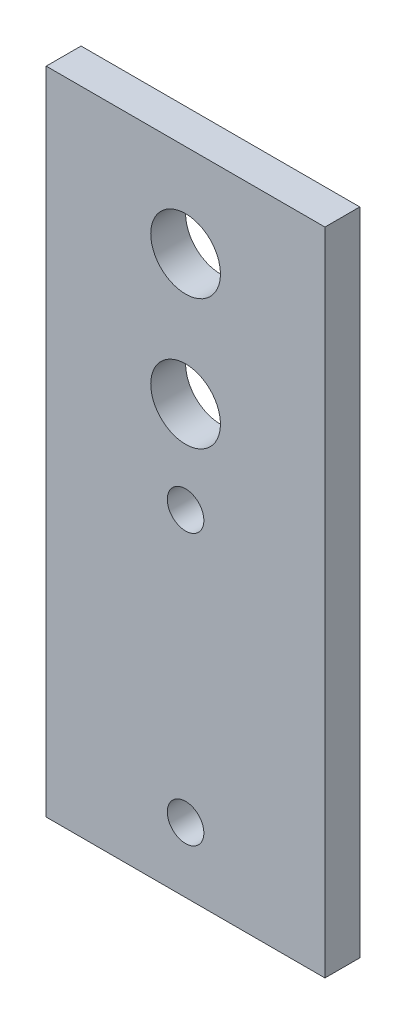
ISO-10303-21;
HEADER;
FILE_DESCRIPTION(('STEP AP214'),'2;1');
FILE_NAME('part.step','',(''),(''),'','','');
FILE_SCHEMA(('AUTOMOTIVE_DESIGN { 1 0 10303 214 1 1 1 1 }'));
ENDSEC;
DATA;
#1=APPLICATION_CONTEXT('core data for automotive mechanical design processes');
#2=APPLICATION_PROTOCOL_DEFINITION('international standard','automotive_design',2000,#1);
#3=PRODUCT_CONTEXT('',#1,'mechanical');
#4=PRODUCT('Part','Part','',(#3));
#5=PRODUCT_RELATED_PRODUCT_CATEGORY('part','',(#4));
#6=PRODUCT_DEFINITION_FORMATION('','',#4);
#7=PRODUCT_DEFINITION_CONTEXT('part definition',#1,'design');
#8=PRODUCT_DEFINITION('design','',#6,#7);
#9=PRODUCT_DEFINITION_SHAPE('','',#8);
#10=(LENGTH_UNIT() NAMED_UNIT(*) SI_UNIT(.MILLI.,.METRE.));
#11=(NAMED_UNIT(*) PLANE_ANGLE_UNIT() SI_UNIT($,.RADIAN.));
#12=(NAMED_UNIT(*) SI_UNIT($,.STERADIAN.) SOLID_ANGLE_UNIT());
#13=UNCERTAINTY_MEASURE_WITH_UNIT(LENGTH_MEASURE(1.E-05),#10,'distance_accuracy_value','');
#14=(GEOMETRIC_REPRESENTATION_CONTEXT(3) GLOBAL_UNCERTAINTY_ASSIGNED_CONTEXT((#13)) GLOBAL_UNIT_ASSIGNED_CONTEXT((#10,
#11,#12)) REPRESENTATION_CONTEXT('',''));
#15=CARTESIAN_POINT('',(0.,0.,0.));
#16=DIRECTION('',(0.,0.,1.));
#17=DIRECTION('',(1.,0.,0.));
#18=AXIS2_PLACEMENT_3D('',#15,#16,#17);
#19=CARTESIAN_POINT('',(0.,0.,4.7625));
#20=DIRECTION('',(0.,0.,-1.));
#21=DIRECTION('',(-1.,0.,0.));
#22=AXIS2_PLACEMENT_3D('',#19,#20,#21);
#23=PLANE('',#22);
#24=DIRECTION('',(0.,-1.,0.));
#25=VECTOR('',#24,1.);
#26=CARTESIAN_POINT('',(0.,0.,4.7625));
#27=LINE('',#26,#25);
#28=CARTESIAN_POINT('',(0.,88.9,4.7625));
#29=VERTEX_POINT('',#28);
#30=CARTESIAN_POINT('',(0.,0.,4.7625));
#31=VERTEX_POINT('',#30);
#32=EDGE_CURVE('E97',#29,#31,#27,.T.);
#33=ORIENTED_EDGE('',*,*,#32,.T.);
#34=DIRECTION('',(1.,0.,0.));
#35=VECTOR('',#34,1.);
#36=CARTESIAN_POINT('',(0.,0.,4.7625));
#37=LINE('',#36,#35);
#38=CARTESIAN_POINT('',(38.1,0.,4.7625));
#39=VERTEX_POINT('',#38);
#40=EDGE_CURVE('E92',#31,#39,#37,.T.);
#41=ORIENTED_EDGE('',*,*,#40,.T.);
#42=DIRECTION('',(0.,1.,0.));
#43=VECTOR('',#42,1.);
#44=CARTESIAN_POINT('',(38.1,0.,4.7625));
#45=LINE('',#44,#43);
#46=CARTESIAN_POINT('',(38.1,88.9,4.7625));
#47=VERTEX_POINT('',#46);
#48=EDGE_CURVE('E95',#39,#47,#45,.T.);
#49=ORIENTED_EDGE('',*,*,#48,.T.);
#50=DIRECTION('',(-1.,0.,0.));
#51=VECTOR('',#50,1.);
#52=CARTESIAN_POINT('',(0.,88.9,4.7625));
#53=LINE('',#52,#51);
#54=EDGE_CURVE('E62',#47,#29,#53,.T.);
#55=ORIENTED_EDGE('',*,*,#54,.T.);
#56=EDGE_LOOP('',(#33,#41,#49,#55));
#57=FACE_BOUND('',#56,.T.);
#58=CARTESIAN_POINT('',(19.05,76.2,4.7625));
#59=DIRECTION('',(0.,0.,1.));
#60=DIRECTION('',(1.,0.,0.));
#61=AXIS2_PLACEMENT_3D('',#58,#59,#60);
#62=CIRCLE('',#61,4.7625);
#63=CARTESIAN_POINT('',(14.2875,76.2,4.7625));
#64=VERTEX_POINT('',#63);
#65=EDGE_CURVE('E118',#64,#64,#62,.T.);
#66=ORIENTED_EDGE('',*,*,#65,.F.);
#67=EDGE_LOOP('',(#66));
#68=FACE_BOUND('',#67,.T.);
#69=CARTESIAN_POINT('',(19.05,8.89,4.7625));
#70=DIRECTION('',(0.,0.,1.));
#71=DIRECTION('',(1.,0.,0.));
#72=AXIS2_PLACEMENT_3D('',#69,#70,#71);
#73=CIRCLE('',#72,2.5);
#74=CARTESIAN_POINT('',(16.55,8.89,4.7625));
#75=VERTEX_POINT('',#74);
#76=EDGE_CURVE('E142',#75,#75,#73,.T.);
#77=ORIENTED_EDGE('',*,*,#76,.F.);
#78=EDGE_LOOP('',(#77));
#79=FACE_BOUND('',#78,.T.);
#80=CARTESIAN_POINT('',(19.05,45.89,4.7625));
#81=DIRECTION('',(0.,0.,1.));
#82=DIRECTION('',(1.,0.,0.));
#83=AXIS2_PLACEMENT_3D('',#80,#81,#82);
#84=CIRCLE('',#83,2.5);
#85=CARTESIAN_POINT('',(16.55,45.89,4.7625));
#86=VERTEX_POINT('',#85);
#87=EDGE_CURVE('E150',#86,#86,#84,.T.);
#88=ORIENTED_EDGE('',*,*,#87,.F.);
#89=EDGE_LOOP('',(#88));
#90=FACE_BOUND('',#89,.T.);
#91=CARTESIAN_POINT('',(19.05,58.42,4.7625));
#92=DIRECTION('',(0.,0.,1.));
#93=DIRECTION('',(1.,0.,0.));
#94=AXIS2_PLACEMENT_3D('',#91,#92,#93);
#95=CIRCLE('',#94,4.7625);
#96=CARTESIAN_POINT('',(14.2875,58.42,4.7625));
#97=VERTEX_POINT('',#96);
#98=EDGE_CURVE('E158',#97,#97,#95,.T.);
#99=ORIENTED_EDGE('',*,*,#98,.F.);
#100=EDGE_LOOP('',(#99));
#101=FACE_BOUND('',#100,.T.);
#102=ADVANCED_FACE('F44',(#57,#68,#79,#90,#101),#23,.F.);
#103=CARTESIAN_POINT('',(0.,0.,0.));
#104=DIRECTION('',(0.,0.,-1.));
#105=DIRECTION('',(-1.,0.,0.));
#106=AXIS2_PLACEMENT_3D('',#103,#104,#105);
#107=PLANE('',#106);
#108=CARTESIAN_POINT('',(19.05,45.89,0.));
#109=DIRECTION('',(0.,0.,1.));
#110=DIRECTION('',(1.,0.,0.));
#111=AXIS2_PLACEMENT_3D('',#108,#109,#110);
#112=CIRCLE('',#111,2.5);
#113=CARTESIAN_POINT('',(16.55,45.89,0.));
#114=VERTEX_POINT('',#113);
#115=EDGE_CURVE('E154',#114,#114,#112,.T.);
#116=ORIENTED_EDGE('',*,*,#115,.T.);
#117=EDGE_LOOP('',(#116));
#118=FACE_BOUND('',#117,.T.);
#119=CARTESIAN_POINT('',(19.05,76.2,0.));
#120=DIRECTION('',(0.,0.,1.));
#121=DIRECTION('',(1.,0.,0.));
#122=AXIS2_PLACEMENT_3D('',#119,#120,#121);
#123=CIRCLE('',#122,4.7625);
#124=CARTESIAN_POINT('',(14.2875,76.2,0.));
#125=VERTEX_POINT('',#124);
#126=EDGE_CURVE('E138',#125,#125,#123,.T.);
#127=ORIENTED_EDGE('',*,*,#126,.T.);
#128=EDGE_LOOP('',(#127));
#129=FACE_BOUND('',#128,.T.);
#130=DIRECTION('',(0.,-1.,0.));
#131=VECTOR('',#130,1.);
#132=CARTESIAN_POINT('',(0.,0.,0.));
#133=LINE('',#132,#131);
#134=CARTESIAN_POINT('',(0.,88.9,0.));
#135=VERTEX_POINT('',#134);
#136=CARTESIAN_POINT('',(0.,0.,0.));
#137=VERTEX_POINT('',#136);
#138=EDGE_CURVE('E114',#135,#137,#133,.T.);
#139=ORIENTED_EDGE('',*,*,#138,.F.);
#140=DIRECTION('',(-1.,0.,0.));
#141=VECTOR('',#140,1.);
#142=CARTESIAN_POINT('',(0.,88.9,0.));
#143=LINE('',#142,#141);
#144=CARTESIAN_POINT('',(38.1,88.9,0.));
#145=VERTEX_POINT('',#144);
#146=EDGE_CURVE('E85',#145,#135,#143,.T.);
#147=ORIENTED_EDGE('',*,*,#146,.F.);
#148=DIRECTION('',(0.,1.,0.));
#149=VECTOR('',#148,1.);
#150=CARTESIAN_POINT('',(38.1,0.,0.));
#151=LINE('',#150,#149);
#152=CARTESIAN_POINT('',(38.1,0.,0.));
#153=VERTEX_POINT('',#152);
#154=EDGE_CURVE('E79',#153,#145,#151,.T.);
#155=ORIENTED_EDGE('',*,*,#154,.F.);
#156=DIRECTION('',(1.,0.,0.));
#157=VECTOR('',#156,1.);
#158=CARTESIAN_POINT('',(0.,0.,0.));
#159=LINE('',#158,#157);
#160=EDGE_CURVE('E102',#137,#153,#159,.T.);
#161=ORIENTED_EDGE('',*,*,#160,.F.);
#162=EDGE_LOOP('',(#139,#147,#155,#161));
#163=FACE_BOUND('',#162,.T.);
#164=CARTESIAN_POINT('',(19.05,8.89,0.));
#165=DIRECTION('',(0.,0.,1.));
#166=DIRECTION('',(1.,0.,0.));
#167=AXIS2_PLACEMENT_3D('',#164,#165,#166);
#168=CIRCLE('',#167,2.5);
#169=CARTESIAN_POINT('',(16.55,8.89,0.));
#170=VERTEX_POINT('',#169);
#171=EDGE_CURVE('E146',#170,#170,#168,.T.);
#172=ORIENTED_EDGE('',*,*,#171,.T.);
#173=EDGE_LOOP('',(#172));
#174=FACE_BOUND('',#173,.T.);
#175=CARTESIAN_POINT('',(19.05,58.42,0.));
#176=DIRECTION('',(0.,0.,1.));
#177=DIRECTION('',(1.,0.,0.));
#178=AXIS2_PLACEMENT_3D('',#175,#176,#177);
#179=CIRCLE('',#178,4.7625);
#180=CARTESIAN_POINT('',(14.2875,58.42,0.));
#181=VERTEX_POINT('',#180);
#182=EDGE_CURVE('E162',#181,#181,#179,.T.);
#183=ORIENTED_EDGE('',*,*,#182,.T.);
#184=EDGE_LOOP('',(#183));
#185=FACE_BOUND('',#184,.T.);
#186=ADVANCED_FACE('F132',(#118,#129,#163,#174,#185),#107,.T.);
#187=CARTESIAN_POINT('',(0.,0.,4.7625));
#188=DIRECTION('',(1.,0.,0.));
#189=DIRECTION('',(0.,0.,-1.));
#190=AXIS2_PLACEMENT_3D('',#187,#188,#189);
#191=PLANE('',#190);
#192=ORIENTED_EDGE('',*,*,#138,.T.);
#193=DIRECTION('',(0.,0.,-1.));
#194=VECTOR('',#193,1.);
#195=CARTESIAN_POINT('',(0.,0.,4.7625));
#196=LINE('',#195,#194);
#197=EDGE_CURVE('E11',#31,#137,#196,.T.);
#198=ORIENTED_EDGE('',*,*,#197,.F.);
#199=ORIENTED_EDGE('',*,*,#32,.F.);
#200=DIRECTION('',(0.,0.,-1.));
#201=VECTOR('',#200,1.);
#202=CARTESIAN_POINT('',(0.,88.9,4.7625));
#203=LINE('',#202,#201);
#204=EDGE_CURVE('E110',#29,#135,#203,.T.);
#205=ORIENTED_EDGE('',*,*,#204,.T.);
#206=EDGE_LOOP('',(#192,#198,#199,#205));
#207=FACE_BOUND('',#206,.T.);
#208=ADVANCED_FACE('F46',(#207),#191,.F.);
#209=CARTESIAN_POINT('',(0.,0.,4.7625));
#210=DIRECTION('',(0.,1.,0.));
#211=DIRECTION('',(0.,0.,1.));
#212=AXIS2_PLACEMENT_3D('',#209,#210,#211);
#213=PLANE('',#212);
#214=ORIENTED_EDGE('',*,*,#160,.T.);
#215=DIRECTION('',(0.,0.,-1.));
#216=VECTOR('',#215,1.);
#217=CARTESIAN_POINT('',(38.1,0.,4.7625));
#218=LINE('',#217,#216);
#219=EDGE_CURVE('E54',#39,#153,#218,.T.);
#220=ORIENTED_EDGE('',*,*,#219,.F.);
#221=ORIENTED_EDGE('',*,*,#40,.F.);
#222=ORIENTED_EDGE('',*,*,#197,.T.);
#223=EDGE_LOOP('',(#214,#220,#221,#222));
#224=FACE_BOUND('',#223,.T.);
#225=ADVANCED_FACE('F101',(#224),#213,.F.);
#226=CARTESIAN_POINT('',(38.1,0.,4.7625));
#227=DIRECTION('',(-1.,0.,0.));
#228=DIRECTION('',(0.,0.,1.));
#229=AXIS2_PLACEMENT_3D('',#226,#227,#228);
#230=PLANE('',#229);
#231=ORIENTED_EDGE('',*,*,#154,.T.);
#232=DIRECTION('',(0.,0.,-1.));
#233=VECTOR('',#232,1.);
#234=CARTESIAN_POINT('',(38.1,88.9,4.7625));
#235=LINE('',#234,#233);
#236=EDGE_CURVE('E104',#47,#145,#235,.T.);
#237=ORIENTED_EDGE('',*,*,#236,.F.);
#238=ORIENTED_EDGE('',*,*,#48,.F.);
#239=ORIENTED_EDGE('',*,*,#219,.T.);
#240=EDGE_LOOP('',(#231,#237,#238,#239));
#241=FACE_BOUND('',#240,.T.);
#242=ADVANCED_FACE('F105',(#241),#230,.F.);
#243=CARTESIAN_POINT('',(0.,88.9,4.7625));
#244=DIRECTION('',(0.,-1.,0.));
#245=DIRECTION('',(0.,0.,-1.));
#246=AXIS2_PLACEMENT_3D('',#243,#244,#245);
#247=PLANE('',#246);
#248=ORIENTED_EDGE('',*,*,#146,.T.);
#249=ORIENTED_EDGE('',*,*,#204,.F.);
#250=ORIENTED_EDGE('',*,*,#54,.F.);
#251=ORIENTED_EDGE('',*,*,#236,.T.);
#252=EDGE_LOOP('',(#248,#249,#250,#251));
#253=FACE_BOUND('',#252,.T.);
#254=ADVANCED_FACE('F129',(#253),#247,.F.);
#255=CARTESIAN_POINT('',(19.05,76.2,4.7625));
#256=DIRECTION('',(0.,0.,-1.));
#257=DIRECTION('',(-1.,0.,0.));
#258=AXIS2_PLACEMENT_3D('',#255,#256,#257);
#259=CYLINDRICAL_SURFACE('',#258,4.7625);
#260=CARTESIAN_POINT('',(14.2875,76.2,4.7625));
#261=CARTESIAN_POINT('',(14.2875,76.2,4.712890625));
#262=CARTESIAN_POINT('',(14.2875,76.2,4.66328125));
#263=CARTESIAN_POINT('',(14.2875,76.2,4.5640625));
#264=CARTESIAN_POINT('',(14.2875,76.2,4.514453125));
#265=CARTESIAN_POINT('',(14.2875,76.2,4.415234375));
#266=CARTESIAN_POINT('',(14.2875,76.2,4.365625));
#267=CARTESIAN_POINT('',(14.2875,76.2,4.26640625));
#268=CARTESIAN_POINT('',(14.2875,76.2,4.216796875));
#269=CARTESIAN_POINT('',(14.2875,76.2,4.117578125));
#270=CARTESIAN_POINT('',(14.2875,76.2,4.06796875));
#271=CARTESIAN_POINT('',(14.2875,76.2,3.96875));
#272=CARTESIAN_POINT('',(14.2875,76.2,3.919140625));
#273=CARTESIAN_POINT('',(14.2875,76.2,3.819921875));
#274=CARTESIAN_POINT('',(14.2875,76.2,3.7703125));
#275=CARTESIAN_POINT('',(14.2875,76.2,3.67109375));
#276=CARTESIAN_POINT('',(14.2875,76.2,3.621484375));
#277=CARTESIAN_POINT('',(14.2875,76.2,3.522265625));
#278=CARTESIAN_POINT('',(14.2875,76.2,3.47265625));
#279=CARTESIAN_POINT('',(14.2875,76.2,3.3734375));
#280=CARTESIAN_POINT('',(14.2875,76.2,3.323828125));
#281=CARTESIAN_POINT('',(14.2875,76.2,3.224609375));
#282=CARTESIAN_POINT('',(14.2875,76.2,3.175));
#283=CARTESIAN_POINT('',(14.2875,76.2,3.07578125));
#284=CARTESIAN_POINT('',(14.2875,76.2,3.026171875));
#285=CARTESIAN_POINT('',(14.2875,76.2,2.926953125));
#286=CARTESIAN_POINT('',(14.2875,76.2,2.87734375));
#287=CARTESIAN_POINT('',(14.2875,76.2,2.778125));
#288=CARTESIAN_POINT('',(14.2875,76.2,2.728515625));
#289=CARTESIAN_POINT('',(14.2875,76.2,2.629296875));
#290=CARTESIAN_POINT('',(14.2875,76.2,2.5796875));
#291=CARTESIAN_POINT('',(14.2875,76.2,2.48046875));
#292=CARTESIAN_POINT('',(14.2875,76.2,2.430859375));
#293=CARTESIAN_POINT('',(14.2875,76.2,2.331640625));
#294=CARTESIAN_POINT('',(14.2875,76.2,2.28203125));
#295=CARTESIAN_POINT('',(14.2875,76.2,2.1828125));
#296=CARTESIAN_POINT('',(14.2875,76.2,2.133203125));
#297=CARTESIAN_POINT('',(14.2875,76.2,2.033984375));
#298=CARTESIAN_POINT('',(14.2875,76.2,1.984375));
#299=CARTESIAN_POINT('',(14.2875,76.2,1.88515625));
#300=CARTESIAN_POINT('',(14.2875,76.2,1.835546875));
#301=CARTESIAN_POINT('',(14.2875,76.2,1.736328125));
#302=CARTESIAN_POINT('',(14.2875,76.2,1.68671875));
#303=CARTESIAN_POINT('',(14.2875,76.2,1.5875));
#304=CARTESIAN_POINT('',(14.2875,76.2,1.537890625));
#305=CARTESIAN_POINT('',(14.2875,76.2,1.438671875));
#306=CARTESIAN_POINT('',(14.2875,76.2,1.3890625));
#307=CARTESIAN_POINT('',(14.2875,76.2,1.28984375));
#308=CARTESIAN_POINT('',(14.2875,76.2,1.240234375));
#309=CARTESIAN_POINT('',(14.2875,76.2,1.141015625));
#310=CARTESIAN_POINT('',(14.2875,76.2,1.09140625));
#311=CARTESIAN_POINT('',(14.2875,76.2,0.992187499999999));
#312=CARTESIAN_POINT('',(14.2875,76.2,0.942578124999999));
#313=CARTESIAN_POINT('',(14.2875,76.2,0.843359375));
#314=CARTESIAN_POINT('',(14.2875,76.2,0.79375));
#315=CARTESIAN_POINT('',(14.2875,76.2,0.69453125));
#316=CARTESIAN_POINT('',(14.2875,76.2,0.644921875));
#317=CARTESIAN_POINT('',(14.2875,76.2,0.545703125));
#318=CARTESIAN_POINT('',(14.2875,76.2,0.49609375));
#319=CARTESIAN_POINT('',(14.2875,76.2,0.396875));
#320=CARTESIAN_POINT('',(14.2875,76.2,0.347265625));
#321=CARTESIAN_POINT('',(14.2875,76.2,0.248046875));
#322=CARTESIAN_POINT('',(14.2875,76.2,0.1984375));
#323=CARTESIAN_POINT('',(14.2875,76.2,0.09921875));
#324=CARTESIAN_POINT('',(14.2875,76.2,0.049609375));
#325=CARTESIAN_POINT('',(14.2875,76.2,0.));
#326=B_SPLINE_CURVE_WITH_KNOTS('',3,(#260,#261,#262,#263,#264,#265,#266,#267,#268,#269,#270,
#271,#272,#273,#274,#275,#276,#277,#278,#279,#280,#281,#282,#283,#284,#285,#286,#287,#288,#289,
#290,#291,#292,#293,#294,#295,#296,#297,#298,#299,#300,#301,#302,#303,#304,#305,#306,#307,#308,
#309,#310,#311,#312,#313,#314,#315,#316,#317,#318,#319,#320,#321,#322,#323,#324,#325),
.UNSPECIFIED.,.F.,.F.,(4,2,2,2,2,2,2,2,2,2,2,2,2,2,2,2,2,2,2,2,2,2,2,2,2,2,2,2,2,2,2,2,4),(0.,
0.148828125,0.29765625,0.446484375,0.5953125,0.744140625,0.892968750000001,1.041796875,1.190625,
1.339453125,1.48828125,1.637109375,1.7859375,1.934765625,2.08359375,2.232421875,2.38125,
2.530078125,2.67890625,2.827734375,2.9765625,3.125390625,3.27421875,3.423046875,3.571875,
3.720703125,3.86953125,4.018359375,4.1671875,4.316015625,4.46484375,4.613671875,4.7625),.UNSPECIFIED.);
#327=EDGE_CURVE('BSEAM182',#64,#125,#326,.T.);
#328=ORIENTED_EDGE('',*,*,#65,.T.);
#329=ORIENTED_EDGE('',*,*,#126,.F.);
#330=ORIENTED_EDGE('',*,*,#327,.T.);
#331=ORIENTED_EDGE('',*,*,#327,.F.);
#332=EDGE_LOOP('',(#328,#330,#329,#331));
#333=FACE_BOUND('',#332,.T.);
#334=ADVANCED_FACE('F182',(#333),#259,.F.);
#335=CARTESIAN_POINT('',(19.05,8.89,4.7625));
#336=DIRECTION('',(0.,0.,-1.));
#337=DIRECTION('',(-1.,0.,0.));
#338=AXIS2_PLACEMENT_3D('',#335,#336,#337);
#339=CYLINDRICAL_SURFACE('',#338,2.5);
#340=CARTESIAN_POINT('',(16.55,8.89,4.7625));
#341=CARTESIAN_POINT('',(16.55,8.89,4.712890625));
#342=CARTESIAN_POINT('',(16.55,8.89,4.66328125));
#343=CARTESIAN_POINT('',(16.55,8.89,4.5640625));
#344=CARTESIAN_POINT('',(16.55,8.89,4.514453125));
#345=CARTESIAN_POINT('',(16.55,8.89,4.415234375));
#346=CARTESIAN_POINT('',(16.55,8.89,4.365625));
#347=CARTESIAN_POINT('',(16.55,8.89,4.26640625));
#348=CARTESIAN_POINT('',(16.55,8.89,4.216796875));
#349=CARTESIAN_POINT('',(16.55,8.89,4.117578125));
#350=CARTESIAN_POINT('',(16.55,8.89,4.06796875));
#351=CARTESIAN_POINT('',(16.55,8.89,3.96875));
#352=CARTESIAN_POINT('',(16.55,8.89,3.919140625));
#353=CARTESIAN_POINT('',(16.55,8.89,3.819921875));
#354=CARTESIAN_POINT('',(16.55,8.89,3.7703125));
#355=CARTESIAN_POINT('',(16.55,8.89,3.67109375));
#356=CARTESIAN_POINT('',(16.55,8.89,3.621484375));
#357=CARTESIAN_POINT('',(16.55,8.89,3.522265625));
#358=CARTESIAN_POINT('',(16.55,8.89,3.47265625));
#359=CARTESIAN_POINT('',(16.55,8.89,3.3734375));
#360=CARTESIAN_POINT('',(16.55,8.89,3.323828125));
#361=CARTESIAN_POINT('',(16.55,8.89,3.224609375));
#362=CARTESIAN_POINT('',(16.55,8.89,3.175));
#363=CARTESIAN_POINT('',(16.55,8.89,3.07578125));
#364=CARTESIAN_POINT('',(16.55,8.89,3.026171875));
#365=CARTESIAN_POINT('',(16.55,8.89,2.926953125));
#366=CARTESIAN_POINT('',(16.55,8.89,2.87734375));
#367=CARTESIAN_POINT('',(16.55,8.89,2.778125));
#368=CARTESIAN_POINT('',(16.55,8.89,2.728515625));
#369=CARTESIAN_POINT('',(16.55,8.89,2.629296875));
#370=CARTESIAN_POINT('',(16.55,8.89,2.5796875));
#371=CARTESIAN_POINT('',(16.55,8.89,2.48046875));
#372=CARTESIAN_POINT('',(16.55,8.89,2.430859375));
#373=CARTESIAN_POINT('',(16.55,8.89,2.331640625));
#374=CARTESIAN_POINT('',(16.55,8.89,2.28203125));
#375=CARTESIAN_POINT('',(16.55,8.89,2.1828125));
#376=CARTESIAN_POINT('',(16.55,8.89,2.133203125));
#377=CARTESIAN_POINT('',(16.55,8.89,2.033984375));
#378=CARTESIAN_POINT('',(16.55,8.89,1.984375));
#379=CARTESIAN_POINT('',(16.55,8.89,1.88515625));
#380=CARTESIAN_POINT('',(16.55,8.89,1.835546875));
#381=CARTESIAN_POINT('',(16.55,8.89,1.736328125));
#382=CARTESIAN_POINT('',(16.55,8.89,1.68671875));
#383=CARTESIAN_POINT('',(16.55,8.89,1.5875));
#384=CARTESIAN_POINT('',(16.55,8.89,1.537890625));
#385=CARTESIAN_POINT('',(16.55,8.89,1.438671875));
#386=CARTESIAN_POINT('',(16.55,8.89,1.3890625));
#387=CARTESIAN_POINT('',(16.55,8.89,1.28984375));
#388=CARTESIAN_POINT('',(16.55,8.89,1.240234375));
#389=CARTESIAN_POINT('',(16.55,8.89,1.141015625));
#390=CARTESIAN_POINT('',(16.55,8.89,1.09140625));
#391=CARTESIAN_POINT('',(16.55,8.89,0.992187499999999));
#392=CARTESIAN_POINT('',(16.55,8.89,0.942578124999999));
#393=CARTESIAN_POINT('',(16.55,8.89,0.843359375));
#394=CARTESIAN_POINT('',(16.55,8.89,0.79375));
#395=CARTESIAN_POINT('',(16.55,8.89,0.69453125));
#396=CARTESIAN_POINT('',(16.55,8.89,0.644921875));
#397=CARTESIAN_POINT('',(16.55,8.89,0.545703125));
#398=CARTESIAN_POINT('',(16.55,8.89,0.49609375));
#399=CARTESIAN_POINT('',(16.55,8.89,0.396875));
#400=CARTESIAN_POINT('',(16.55,8.89,0.347265625));
#401=CARTESIAN_POINT('',(16.55,8.89,0.248046875));
#402=CARTESIAN_POINT('',(16.55,8.89,0.1984375));
#403=CARTESIAN_POINT('',(16.55,8.89,0.09921875));
#404=CARTESIAN_POINT('',(16.55,8.89,0.049609375));
#405=CARTESIAN_POINT('',(16.55,8.89,0.));
#406=B_SPLINE_CURVE_WITH_KNOTS('',3,(#340,#341,#342,#343,#344,#345,#346,#347,#348,#349,#350,
#351,#352,#353,#354,#355,#356,#357,#358,#359,#360,#361,#362,#363,#364,#365,#366,#367,#368,#369,
#370,#371,#372,#373,#374,#375,#376,#377,#378,#379,#380,#381,#382,#383,#384,#385,#386,#387,#388,
#389,#390,#391,#392,#393,#394,#395,#396,#397,#398,#399,#400,#401,#402,#403,#404,#405),
.UNSPECIFIED.,.F.,.F.,(4,2,2,2,2,2,2,2,2,2,2,2,2,2,2,2,2,2,2,2,2,2,2,2,2,2,2,2,2,2,2,2,4),(0.,
0.148828125,0.29765625,0.446484375,0.5953125,0.744140625,0.892968750000001,1.041796875,1.190625,
1.339453125,1.48828125,1.637109375,1.7859375,1.934765625,2.08359375,2.232421875,2.38125,
2.530078125,2.67890625,2.827734375,2.9765625,3.125390625,3.27421875,3.423046875,3.571875,
3.720703125,3.86953125,4.018359375,4.1671875,4.316015625,4.46484375,4.613671875,4.7625),.UNSPECIFIED.);
#407=EDGE_CURVE('BSEAM236',#75,#170,#406,.T.);
#408=ORIENTED_EDGE('',*,*,#76,.T.);
#409=ORIENTED_EDGE('',*,*,#171,.F.);
#410=ORIENTED_EDGE('',*,*,#407,.T.);
#411=ORIENTED_EDGE('',*,*,#407,.F.);
#412=EDGE_LOOP('',(#408,#410,#409,#411));
#413=FACE_BOUND('',#412,.T.);
#414=ADVANCED_FACE('F236',(#413),#339,.F.);
#415=CARTESIAN_POINT('',(19.05,45.89,4.7625));
#416=DIRECTION('',(0.,0.,-1.));
#417=DIRECTION('',(-1.,0.,0.));
#418=AXIS2_PLACEMENT_3D('',#415,#416,#417);
#419=CYLINDRICAL_SURFACE('',#418,2.5);
#420=CARTESIAN_POINT('',(16.55,45.89,4.7625));
#421=CARTESIAN_POINT('',(16.55,45.89,4.712890625));
#422=CARTESIAN_POINT('',(16.55,45.89,4.66328125));
#423=CARTESIAN_POINT('',(16.55,45.89,4.5640625));
#424=CARTESIAN_POINT('',(16.55,45.89,4.514453125));
#425=CARTESIAN_POINT('',(16.55,45.89,4.415234375));
#426=CARTESIAN_POINT('',(16.55,45.89,4.365625));
#427=CARTESIAN_POINT('',(16.55,45.89,4.26640625));
#428=CARTESIAN_POINT('',(16.55,45.89,4.216796875));
#429=CARTESIAN_POINT('',(16.55,45.89,4.117578125));
#430=CARTESIAN_POINT('',(16.55,45.89,4.06796875));
#431=CARTESIAN_POINT('',(16.55,45.89,3.96875));
#432=CARTESIAN_POINT('',(16.55,45.89,3.919140625));
#433=CARTESIAN_POINT('',(16.55,45.89,3.819921875));
#434=CARTESIAN_POINT('',(16.55,45.89,3.7703125));
#435=CARTESIAN_POINT('',(16.55,45.89,3.67109375));
#436=CARTESIAN_POINT('',(16.55,45.89,3.621484375));
#437=CARTESIAN_POINT('',(16.55,45.89,3.522265625));
#438=CARTESIAN_POINT('',(16.55,45.89,3.47265625));
#439=CARTESIAN_POINT('',(16.55,45.89,3.3734375));
#440=CARTESIAN_POINT('',(16.55,45.89,3.323828125));
#441=CARTESIAN_POINT('',(16.55,45.89,3.224609375));
#442=CARTESIAN_POINT('',(16.55,45.89,3.175));
#443=CARTESIAN_POINT('',(16.55,45.89,3.07578125));
#444=CARTESIAN_POINT('',(16.55,45.89,3.026171875));
#445=CARTESIAN_POINT('',(16.55,45.89,2.926953125));
#446=CARTESIAN_POINT('',(16.55,45.89,2.87734375));
#447=CARTESIAN_POINT('',(16.55,45.89,2.778125));
#448=CARTESIAN_POINT('',(16.55,45.89,2.728515625));
#449=CARTESIAN_POINT('',(16.55,45.89,2.629296875));
#450=CARTESIAN_POINT('',(16.55,45.89,2.5796875));
#451=CARTESIAN_POINT('',(16.55,45.89,2.48046875));
#452=CARTESIAN_POINT('',(16.55,45.89,2.430859375));
#453=CARTESIAN_POINT('',(16.55,45.89,2.331640625));
#454=CARTESIAN_POINT('',(16.55,45.89,2.28203125));
#455=CARTESIAN_POINT('',(16.55,45.89,2.1828125));
#456=CARTESIAN_POINT('',(16.55,45.89,2.133203125));
#457=CARTESIAN_POINT('',(16.55,45.89,2.033984375));
#458=CARTESIAN_POINT('',(16.55,45.89,1.984375));
#459=CARTESIAN_POINT('',(16.55,45.89,1.88515625));
#460=CARTESIAN_POINT('',(16.55,45.89,1.835546875));
#461=CARTESIAN_POINT('',(16.55,45.89,1.736328125));
#462=CARTESIAN_POINT('',(16.55,45.89,1.68671875));
#463=CARTESIAN_POINT('',(16.55,45.89,1.5875));
#464=CARTESIAN_POINT('',(16.55,45.89,1.537890625));
#465=CARTESIAN_POINT('',(16.55,45.89,1.438671875));
#466=CARTESIAN_POINT('',(16.55,45.89,1.3890625));
#467=CARTESIAN_POINT('',(16.55,45.89,1.28984375));
#468=CARTESIAN_POINT('',(16.55,45.89,1.240234375));
#469=CARTESIAN_POINT('',(16.55,45.89,1.141015625));
#470=CARTESIAN_POINT('',(16.55,45.89,1.09140625));
#471=CARTESIAN_POINT('',(16.55,45.89,0.992187499999999));
#472=CARTESIAN_POINT('',(16.55,45.89,0.942578124999999));
#473=CARTESIAN_POINT('',(16.55,45.89,0.843359375));
#474=CARTESIAN_POINT('',(16.55,45.89,0.79375));
#475=CARTESIAN_POINT('',(16.55,45.89,0.69453125));
#476=CARTESIAN_POINT('',(16.55,45.89,0.644921875));
#477=CARTESIAN_POINT('',(16.55,45.89,0.545703125));
#478=CARTESIAN_POINT('',(16.55,45.89,0.49609375));
#479=CARTESIAN_POINT('',(16.55,45.89,0.396875));
#480=CARTESIAN_POINT('',(16.55,45.89,0.347265625));
#481=CARTESIAN_POINT('',(16.55,45.89,0.248046875));
#482=CARTESIAN_POINT('',(16.55,45.89,0.1984375));
#483=CARTESIAN_POINT('',(16.55,45.89,0.09921875));
#484=CARTESIAN_POINT('',(16.55,45.89,0.049609375));
#485=CARTESIAN_POINT('',(16.55,45.89,0.));
#486=B_SPLINE_CURVE_WITH_KNOTS('',3,(#420,#421,#422,#423,#424,#425,#426,#427,#428,#429,#430,
#431,#432,#433,#434,#435,#436,#437,#438,#439,#440,#441,#442,#443,#444,#445,#446,#447,#448,#449,
#450,#451,#452,#453,#454,#455,#456,#457,#458,#459,#460,#461,#462,#463,#464,#465,#466,#467,#468,
#469,#470,#471,#472,#473,#474,#475,#476,#477,#478,#479,#480,#481,#482,#483,#484,#485),
.UNSPECIFIED.,.F.,.F.,(4,2,2,2,2,2,2,2,2,2,2,2,2,2,2,2,2,2,2,2,2,2,2,2,2,2,2,2,2,2,2,2,4),(0.,
0.148828125,0.29765625,0.446484375,0.5953125,0.744140625,0.892968750000001,1.041796875,1.190625,
1.339453125,1.48828125,1.637109375,1.7859375,1.934765625,2.08359375,2.232421875,2.38125,
2.530078125,2.67890625,2.827734375,2.9765625,3.125390625,3.27421875,3.423046875,3.571875,
3.720703125,3.86953125,4.018359375,4.1671875,4.316015625,4.46484375,4.613671875,4.7625),.UNSPECIFIED.);
#487=EDGE_CURVE('BSEAM245',#86,#114,#486,.T.);
#488=ORIENTED_EDGE('',*,*,#87,.T.);
#489=ORIENTED_EDGE('',*,*,#115,.F.);
#490=ORIENTED_EDGE('',*,*,#487,.T.);
#491=ORIENTED_EDGE('',*,*,#487,.F.);
#492=EDGE_LOOP('',(#488,#490,#489,#491));
#493=FACE_BOUND('',#492,.T.);
#494=ADVANCED_FACE('F245',(#493),#419,.F.);
#495=CARTESIAN_POINT('',(19.05,58.42,4.7625));
#496=DIRECTION('',(0.,0.,-1.));
#497=DIRECTION('',(-1.,0.,0.));
#498=AXIS2_PLACEMENT_3D('',#495,#496,#497);
#499=CYLINDRICAL_SURFACE('',#498,4.7625);
#500=CARTESIAN_POINT('',(14.2875,58.42,4.7625));
#501=CARTESIAN_POINT('',(14.2875,58.42,4.712890625));
#502=CARTESIAN_POINT('',(14.2875,58.42,4.66328125));
#503=CARTESIAN_POINT('',(14.2875,58.42,4.5640625));
#504=CARTESIAN_POINT('',(14.2875,58.42,4.514453125));
#505=CARTESIAN_POINT('',(14.2875,58.42,4.415234375));
#506=CARTESIAN_POINT('',(14.2875,58.42,4.365625));
#507=CARTESIAN_POINT('',(14.2875,58.42,4.26640625));
#508=CARTESIAN_POINT('',(14.2875,58.42,4.216796875));
#509=CARTESIAN_POINT('',(14.2875,58.42,4.117578125));
#510=CARTESIAN_POINT('',(14.2875,58.42,4.06796875));
#511=CARTESIAN_POINT('',(14.2875,58.42,3.96875));
#512=CARTESIAN_POINT('',(14.2875,58.42,3.919140625));
#513=CARTESIAN_POINT('',(14.2875,58.42,3.819921875));
#514=CARTESIAN_POINT('',(14.2875,58.42,3.7703125));
#515=CARTESIAN_POINT('',(14.2875,58.42,3.67109375));
#516=CARTESIAN_POINT('',(14.2875,58.42,3.621484375));
#517=CARTESIAN_POINT('',(14.2875,58.42,3.522265625));
#518=CARTESIAN_POINT('',(14.2875,58.42,3.47265625));
#519=CARTESIAN_POINT('',(14.2875,58.42,3.3734375));
#520=CARTESIAN_POINT('',(14.2875,58.42,3.323828125));
#521=CARTESIAN_POINT('',(14.2875,58.42,3.224609375));
#522=CARTESIAN_POINT('',(14.2875,58.42,3.175));
#523=CARTESIAN_POINT('',(14.2875,58.42,3.07578125));
#524=CARTESIAN_POINT('',(14.2875,58.42,3.026171875));
#525=CARTESIAN_POINT('',(14.2875,58.42,2.926953125));
#526=CARTESIAN_POINT('',(14.2875,58.42,2.87734375));
#527=CARTESIAN_POINT('',(14.2875,58.42,2.778125));
#528=CARTESIAN_POINT('',(14.2875,58.42,2.728515625));
#529=CARTESIAN_POINT('',(14.2875,58.42,2.629296875));
#530=CARTESIAN_POINT('',(14.2875,58.42,2.5796875));
#531=CARTESIAN_POINT('',(14.2875,58.42,2.48046875));
#532=CARTESIAN_POINT('',(14.2875,58.42,2.430859375));
#533=CARTESIAN_POINT('',(14.2875,58.42,2.331640625));
#534=CARTESIAN_POINT('',(14.2875,58.42,2.28203125));
#535=CARTESIAN_POINT('',(14.2875,58.42,2.1828125));
#536=CARTESIAN_POINT('',(14.2875,58.42,2.133203125));
#537=CARTESIAN_POINT('',(14.2875,58.42,2.033984375));
#538=CARTESIAN_POINT('',(14.2875,58.42,1.984375));
#539=CARTESIAN_POINT('',(14.2875,58.42,1.88515625));
#540=CARTESIAN_POINT('',(14.2875,58.42,1.835546875));
#541=CARTESIAN_POINT('',(14.2875,58.42,1.736328125));
#542=CARTESIAN_POINT('',(14.2875,58.42,1.68671875));
#543=CARTESIAN_POINT('',(14.2875,58.42,1.5875));
#544=CARTESIAN_POINT('',(14.2875,58.42,1.537890625));
#545=CARTESIAN_POINT('',(14.2875,58.42,1.438671875));
#546=CARTESIAN_POINT('',(14.2875,58.42,1.3890625));
#547=CARTESIAN_POINT('',(14.2875,58.42,1.28984375));
#548=CARTESIAN_POINT('',(14.2875,58.42,1.240234375));
#549=CARTESIAN_POINT('',(14.2875,58.42,1.141015625));
#550=CARTESIAN_POINT('',(14.2875,58.42,1.09140625));
#551=CARTESIAN_POINT('',(14.2875,58.42,0.992187499999999));
#552=CARTESIAN_POINT('',(14.2875,58.42,0.942578124999999));
#553=CARTESIAN_POINT('',(14.2875,58.42,0.843359375));
#554=CARTESIAN_POINT('',(14.2875,58.42,0.79375));
#555=CARTESIAN_POINT('',(14.2875,58.42,0.69453125));
#556=CARTESIAN_POINT('',(14.2875,58.42,0.644921875));
#557=CARTESIAN_POINT('',(14.2875,58.42,0.545703125));
#558=CARTESIAN_POINT('',(14.2875,58.42,0.49609375));
#559=CARTESIAN_POINT('',(14.2875,58.42,0.396875));
#560=CARTESIAN_POINT('',(14.2875,58.42,0.347265625));
#561=CARTESIAN_POINT('',(14.2875,58.42,0.248046875));
#562=CARTESIAN_POINT('',(14.2875,58.42,0.1984375));
#563=CARTESIAN_POINT('',(14.2875,58.42,0.09921875));
#564=CARTESIAN_POINT('',(14.2875,58.42,0.049609375));
#565=CARTESIAN_POINT('',(14.2875,58.42,0.));
#566=B_SPLINE_CURVE_WITH_KNOTS('',3,(#500,#501,#502,#503,#504,#505,#506,#507,#508,#509,#510,
#511,#512,#513,#514,#515,#516,#517,#518,#519,#520,#521,#522,#523,#524,#525,#526,#527,#528,#529,
#530,#531,#532,#533,#534,#535,#536,#537,#538,#539,#540,#541,#542,#543,#544,#545,#546,#547,#548,
#549,#550,#551,#552,#553,#554,#555,#556,#557,#558,#559,#560,#561,#562,#563,#564,#565),
.UNSPECIFIED.,.F.,.F.,(4,2,2,2,2,2,2,2,2,2,2,2,2,2,2,2,2,2,2,2,2,2,2,2,2,2,2,2,2,2,2,2,4),(0.,
0.148828125,0.29765625,0.446484375,0.5953125,0.744140625,0.892968750000001,1.041796875,1.190625,
1.339453125,1.48828125,1.637109375,1.7859375,1.934765625,2.08359375,2.232421875,2.38125,
2.530078125,2.67890625,2.827734375,2.9765625,3.125390625,3.27421875,3.423046875,3.571875,
3.720703125,3.86953125,4.018359375,4.1671875,4.316015625,4.46484375,4.613671875,4.7625),.UNSPECIFIED.);
#567=EDGE_CURVE('BSEAM171',#97,#181,#566,.T.);
#568=ORIENTED_EDGE('',*,*,#98,.T.);
#569=ORIENTED_EDGE('',*,*,#182,.F.);
#570=ORIENTED_EDGE('',*,*,#567,.T.);
#571=ORIENTED_EDGE('',*,*,#567,.F.);
#572=EDGE_LOOP('',(#568,#570,#569,#571));
#573=FACE_BOUND('',#572,.T.);
#574=ADVANCED_FACE('F171',(#573),#499,.F.);
#575=CLOSED_SHELL('',(#102,#186,#208,#225,#242,#254,#334,#414,#494,#574));
#576=MANIFOLD_SOLID_BREP('B2',#575);
#577=ADVANCED_BREP_SHAPE_REPRESENTATION('',(#18,#576),#14);
#578=SHAPE_DEFINITION_REPRESENTATION(#9,#577);
ENDSEC;
END-ISO-10303-21;
